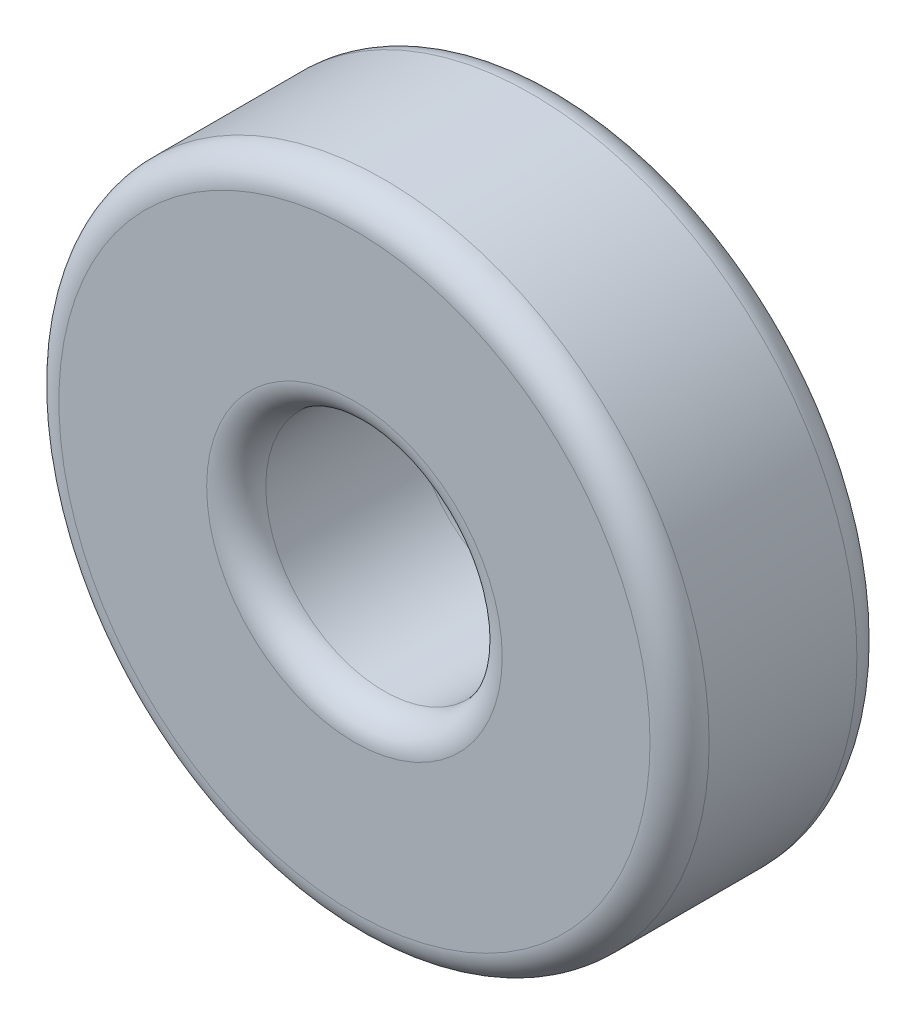
ISO-10303-21;
HEADER;
FILE_DESCRIPTION(('STEP AP214'),'2;1');
FILE_NAME('part.step','',(''),(''),'','','');
FILE_SCHEMA(('AUTOMOTIVE_DESIGN { 1 0 10303 214 1 1 1 1 }'));
ENDSEC;
DATA;
#1=APPLICATION_CONTEXT('core data for automotive mechanical design processes');
#2=APPLICATION_PROTOCOL_DEFINITION('international standard','automotive_design',2000,#1);
#3=PRODUCT_CONTEXT('',#1,'mechanical');
#4=PRODUCT('Part','Part','',(#3));
#5=PRODUCT_RELATED_PRODUCT_CATEGORY('part','',(#4));
#6=PRODUCT_DEFINITION_FORMATION('','',#4);
#7=PRODUCT_DEFINITION_CONTEXT('part definition',#1,'design');
#8=PRODUCT_DEFINITION('design','',#6,#7);
#9=PRODUCT_DEFINITION_SHAPE('','',#8);
#10=(LENGTH_UNIT() NAMED_UNIT(*) SI_UNIT(.MILLI.,.METRE.));
#11=(NAMED_UNIT(*) PLANE_ANGLE_UNIT() SI_UNIT($,.RADIAN.));
#12=(NAMED_UNIT(*) SI_UNIT($,.STERADIAN.) SOLID_ANGLE_UNIT());
#13=UNCERTAINTY_MEASURE_WITH_UNIT(LENGTH_MEASURE(1.E-05),#10,'distance_accuracy_value','');
#14=(GEOMETRIC_REPRESENTATION_CONTEXT(3) GLOBAL_UNCERTAINTY_ASSIGNED_CONTEXT((#13)) GLOBAL_UNIT_ASSIGNED_CONTEXT((#10,
#11,#12)) REPRESENTATION_CONTEXT('',''));
#15=CARTESIAN_POINT('',(0.,0.,0.));
#16=DIRECTION('',(0.,0.,1.));
#17=DIRECTION('',(1.,0.,0.));
#18=AXIS2_PLACEMENT_3D('',#15,#16,#17);
#19=CARTESIAN_POINT('',(0.,0.,3.5));
#20=DIRECTION('',(0.,0.,1.));
#21=DIRECTION('',(1.,0.,0.));
#22=AXIS2_PLACEMENT_3D('',#19,#20,#21);
#23=PLANE('',#22);
#24=CARTESIAN_POINT('',(0.,0.,3.5));
#25=DIRECTION('',(0.,0.,1.));
#26=DIRECTION('',(1.,0.,0.));
#27=AXIS2_PLACEMENT_3D('',#24,#25,#26);
#28=CIRCLE('',#27,5.);
#29=CARTESIAN_POINT('',(5.,0.,3.5));
#30=VERTEX_POINT('',#29);
#31=EDGE_CURVE('E47',#30,#30,#28,.F.);
#32=ORIENTED_EDGE('',*,*,#31,.T.);
#33=EDGE_LOOP('',(#32));
#34=FACE_BOUND('',#33,.T.);
#35=CARTESIAN_POINT('',(0.,0.,3.5));
#36=DIRECTION('',(0.,0.,1.));
#37=DIRECTION('',(1.,0.,0.));
#38=AXIS2_PLACEMENT_3D('',#35,#36,#37);
#39=CIRCLE('',#38,10.);
#40=CARTESIAN_POINT('',(10.,0.,3.5));
#41=VERTEX_POINT('',#40);
#42=EDGE_CURVE('E52',#41,#41,#39,.T.);
#43=ORIENTED_EDGE('',*,*,#42,.T.);
#44=EDGE_LOOP('',(#43));
#45=FACE_BOUND('',#44,.T.);
#46=ADVANCED_FACE('F36',(#34,#45),#23,.T.);
#47=CARTESIAN_POINT('',(0.,0.,-3.5));
#48=DIRECTION('',(0.,0.,1.));
#49=DIRECTION('',(1.,0.,0.));
#50=AXIS2_PLACEMENT_3D('',#47,#48,#49);
#51=PLANE('',#50);
#52=CARTESIAN_POINT('',(0.,0.,-3.5));
#53=DIRECTION('',(0.,0.,1.));
#54=DIRECTION('',(1.,0.,0.));
#55=AXIS2_PLACEMENT_3D('',#52,#53,#54);
#56=CIRCLE('',#55,5.);
#57=CARTESIAN_POINT('',(5.,0.,-3.5));
#58=VERTEX_POINT('',#57);
#59=EDGE_CURVE('E62',#58,#58,#56,.T.);
#60=ORIENTED_EDGE('',*,*,#59,.T.);
#61=EDGE_LOOP('',(#60));
#62=FACE_BOUND('',#61,.T.);
#63=CARTESIAN_POINT('',(0.,0.,-3.5));
#64=DIRECTION('',(0.,0.,1.));
#65=DIRECTION('',(1.,0.,0.));
#66=AXIS2_PLACEMENT_3D('',#63,#64,#65);
#67=CIRCLE('',#66,10.);
#68=CARTESIAN_POINT('',(10.,0.,-3.5));
#69=VERTEX_POINT('',#68);
#70=EDGE_CURVE('E70',#69,#69,#67,.F.);
#71=ORIENTED_EDGE('',*,*,#70,.T.);
#72=EDGE_LOOP('',(#71));
#73=FACE_BOUND('',#72,.T.);
#74=ADVANCED_FACE('F72',(#62,#73),#51,.F.);
#75=CARTESIAN_POINT('',(0.,0.,3.5));
#76=DIRECTION('',(0.,0.,-1.));
#77=DIRECTION('',(-1.,0.,0.));
#78=AXIS2_PLACEMENT_3D('',#75,#76,#77);
#79=CYLINDRICAL_SURFACE('',#78,11.);
#80=CARTESIAN_POINT('',(0.,0.,-2.5));
#81=DIRECTION('',(0.,0.,1.));
#82=DIRECTION('',(1.,0.,0.));
#83=AXIS2_PLACEMENT_3D('',#80,#81,#82);
#84=CIRCLE('',#83,11.);
#85=CARTESIAN_POINT('',(11.,0.,-2.5));
#86=VERTEX_POINT('',#85);
#87=EDGE_CURVE('E10',#86,#86,#84,.T.);
#88=ORIENTED_EDGE('',*,*,#87,.T.);
#89=EDGE_LOOP('',(#88));
#90=FACE_BOUND('',#89,.T.);
#91=CARTESIAN_POINT('',(0.,0.,2.5));
#92=DIRECTION('',(0.,0.,1.));
#93=DIRECTION('',(1.,0.,0.));
#94=AXIS2_PLACEMENT_3D('',#91,#92,#93);
#95=CIRCLE('',#94,11.);
#96=CARTESIAN_POINT('',(11.,0.,2.5));
#97=VERTEX_POINT('',#96);
#98=EDGE_CURVE('E44',#97,#97,#95,.F.);
#99=ORIENTED_EDGE('',*,*,#98,.T.);
#100=EDGE_LOOP('',(#99));
#101=FACE_BOUND('',#100,.T.);
#102=ADVANCED_FACE('F93',(#90,#101),#79,.T.);
#103=CARTESIAN_POINT('',(0.,0.,3.5));
#104=DIRECTION('',(0.,0.,-1.));
#105=DIRECTION('',(-1.,0.,0.));
#106=AXIS2_PLACEMENT_3D('',#103,#104,#105);
#107=CYLINDRICAL_SURFACE('',#106,4.);
#108=CARTESIAN_POINT('',(0.,0.,-2.5));
#109=DIRECTION('',(0.,0.,1.));
#110=DIRECTION('',(1.,0.,0.));
#111=AXIS2_PLACEMENT_3D('',#108,#109,#110);
#112=CIRCLE('',#111,4.);
#113=CARTESIAN_POINT('',(4.,0.,-2.5));
#114=VERTEX_POINT('',#113);
#115=EDGE_CURVE('E59',#114,#114,#112,.F.);
#116=ORIENTED_EDGE('',*,*,#115,.T.);
#117=EDGE_LOOP('',(#116));
#118=FACE_BOUND('',#117,.T.);
#119=CARTESIAN_POINT('',(0.,0.,2.5));
#120=DIRECTION('',(0.,0.,1.));
#121=DIRECTION('',(1.,0.,0.));
#122=AXIS2_PLACEMENT_3D('',#119,#120,#121);
#123=CIRCLE('',#122,4.);
#124=CARTESIAN_POINT('',(4.,0.,2.5));
#125=VERTEX_POINT('',#124);
#126=EDGE_CURVE('E63',#125,#125,#123,.T.);
#127=ORIENTED_EDGE('',*,*,#126,.T.);
#128=EDGE_LOOP('',(#127));
#129=FACE_BOUND('',#128,.T.);
#130=ADVANCED_FACE('F96',(#118,#129),#107,.F.);
#131=CARTESIAN_POINT('',(0.,0.,-2.5));
#132=DIRECTION('',(0.,0.,1.));
#133=DIRECTION('',(1.,0.,0.));
#134=AXIS2_PLACEMENT_3D('',#131,#132,#133);
#135=TOROIDAL_SURFACE('',#134,5.,1.);
#136=ORIENTED_EDGE('',*,*,#115,.F.);
#137=EDGE_LOOP('',(#136));
#138=FACE_BOUND('',#137,.T.);
#139=ORIENTED_EDGE('',*,*,#59,.F.);
#140=EDGE_LOOP('',(#139));
#141=FACE_BOUND('',#140,.T.);
#142=ADVANCED_FACE('F84',(#138,#141),#135,.T.);
#143=CARTESIAN_POINT('',(0.,0.,2.5));
#144=DIRECTION('',(0.,0.,1.));
#145=DIRECTION('',(1.,0.,0.));
#146=AXIS2_PLACEMENT_3D('',#143,#144,#145);
#147=TOROIDAL_SURFACE('',#146,5.,1.);
#148=ORIENTED_EDGE('',*,*,#31,.F.);
#149=EDGE_LOOP('',(#148));
#150=FACE_BOUND('',#149,.T.);
#151=ORIENTED_EDGE('',*,*,#126,.F.);
#152=EDGE_LOOP('',(#151));
#153=FACE_BOUND('',#152,.T.);
#154=ADVANCED_FACE('F78',(#150,#153),#147,.T.);
#155=CARTESIAN_POINT('',(0.,0.,-2.5));
#156=DIRECTION('',(0.,0.,1.));
#157=DIRECTION('',(1.,0.,0.));
#158=AXIS2_PLACEMENT_3D('',#155,#156,#157);
#159=TOROIDAL_SURFACE('',#158,10.,1.);
#160=ORIENTED_EDGE('',*,*,#70,.F.);
#161=EDGE_LOOP('',(#160));
#162=FACE_BOUND('',#161,.T.);
#163=ORIENTED_EDGE('',*,*,#87,.F.);
#164=EDGE_LOOP('',(#163));
#165=FACE_BOUND('',#164,.T.);
#166=ADVANCED_FACE('F71',(#162,#165),#159,.T.);
#167=CARTESIAN_POINT('',(0.,0.,2.5));
#168=DIRECTION('',(0.,0.,1.));
#169=DIRECTION('',(1.,0.,0.));
#170=AXIS2_PLACEMENT_3D('',#167,#168,#169);
#171=TOROIDAL_SURFACE('',#170,10.,1.);
#172=ORIENTED_EDGE('',*,*,#98,.F.);
#173=EDGE_LOOP('',(#172));
#174=FACE_BOUND('',#173,.T.);
#175=ORIENTED_EDGE('',*,*,#42,.F.);
#176=EDGE_LOOP('',(#175));
#177=FACE_BOUND('',#176,.T.);
#178=ADVANCED_FACE('F37',(#174,#177),#171,.T.);
#179=CLOSED_SHELL('',(#46,#74,#102,#130,#142,#154,#166,#178));
#180=MANIFOLD_SOLID_BREP('B2',#179);
#181=ADVANCED_BREP_SHAPE_REPRESENTATION('',(#18,#180),#14);
#182=SHAPE_DEFINITION_REPRESENTATION(#9,#181);
ENDSEC;
END-ISO-10303-21;
